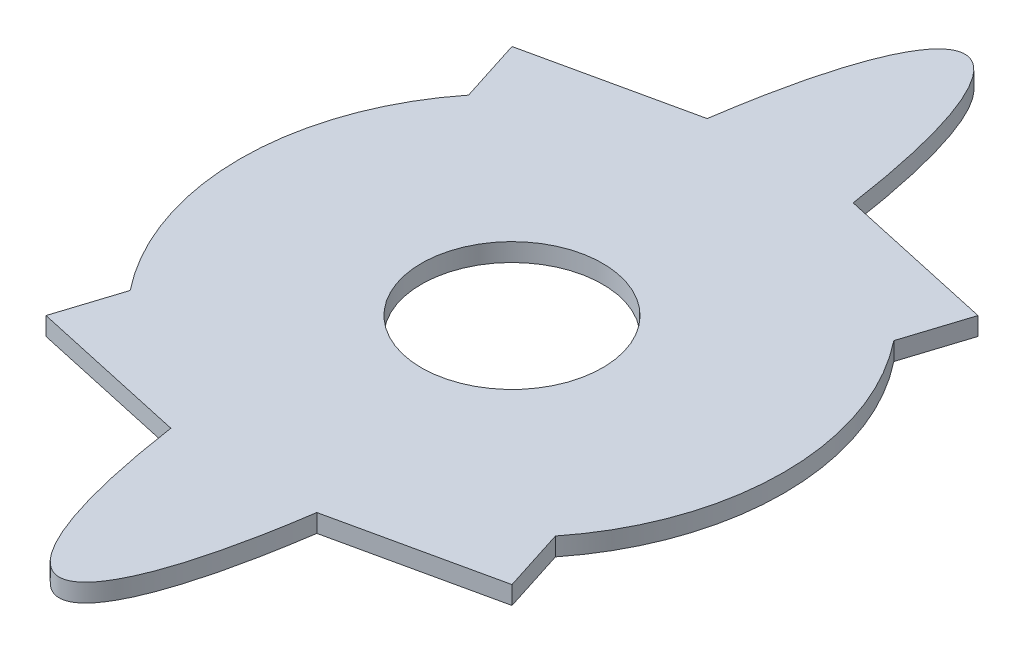
ISO-10303-21;
HEADER;
FILE_DESCRIPTION(('STEP AP214'),'2;1');
FILE_NAME('part.step','',(''),(''),'','','');
FILE_SCHEMA(('AUTOMOTIVE_DESIGN { 1 0 10303 214 1 1 1 1 }'));
ENDSEC;
DATA;
#1=APPLICATION_CONTEXT('core data for automotive mechanical design processes');
#2=APPLICATION_PROTOCOL_DEFINITION('international standard','automotive_design',2000,#1);
#3=PRODUCT_CONTEXT('',#1,'mechanical');
#4=PRODUCT('Part','Part','',(#3));
#5=PRODUCT_RELATED_PRODUCT_CATEGORY('part','',(#4));
#6=PRODUCT_DEFINITION_FORMATION('','',#4);
#7=PRODUCT_DEFINITION_CONTEXT('part definition',#1,'design');
#8=PRODUCT_DEFINITION('design','',#6,#7);
#9=PRODUCT_DEFINITION_SHAPE('','',#8);
#10=(LENGTH_UNIT() NAMED_UNIT(*) SI_UNIT(.MILLI.,.METRE.));
#11=(NAMED_UNIT(*) PLANE_ANGLE_UNIT() SI_UNIT($,.RADIAN.));
#12=(NAMED_UNIT(*) SI_UNIT($,.STERADIAN.) SOLID_ANGLE_UNIT());
#13=UNCERTAINTY_MEASURE_WITH_UNIT(LENGTH_MEASURE(1.E-05),#10,'distance_accuracy_value','');
#14=(GEOMETRIC_REPRESENTATION_CONTEXT(3) GLOBAL_UNCERTAINTY_ASSIGNED_CONTEXT((#13)) GLOBAL_UNIT_ASSIGNED_CONTEXT((#10,
#11,#12)) REPRESENTATION_CONTEXT('',''));
#15=CARTESIAN_POINT('',(0.,0.,0.));
#16=DIRECTION('',(0.,0.,1.));
#17=DIRECTION('',(1.,0.,0.));
#18=AXIS2_PLACEMENT_3D('',#15,#16,#17);
#19=CARTESIAN_POINT('',(-6.57913665277068,2.,29.9329249695814));
#20=DIRECTION('',(0.214671716521423,0.,-0.976686261870078));
#21=DIRECTION('',(-0.976686261870078,0.,-0.214671716521423));
#22=AXIS2_PLACEMENT_3D('',#19,#20,#21);
#23=PLANE('',#22);
#24=DIRECTION('',(0.976686261870078,0.,0.214671716521423));
#25=VECTOR('',#24,1.);
#26=CARTESIAN_POINT('',(-6.57913665277068,0.,29.9329249695814));
#27=LINE('',#26,#25);
#28=CARTESIAN_POINT('',(-25.7247877713763,0.,25.7247877713763));
#29=VERTEX_POINT('',#28);
#30=CARTESIAN_POINT('',(-8.05822964025379,0.,29.6078262731896));
#31=VERTEX_POINT('',#30);
#32=EDGE_CURVE('E158',#29,#31,#27,.T.);
#33=ORIENTED_EDGE('',*,*,#32,.T.);
#34=DIRECTION('',(0.,-1.,0.));
#35=VECTOR('',#34,1.);
#36=CARTESIAN_POINT('',(-8.05822964025379,2.,29.6078262731896));
#37=LINE('',#36,#35);
#38=CARTESIAN_POINT('',(-8.05822964025379,2.,29.6078262731896));
#39=VERTEX_POINT('',#38);
#40=EDGE_CURVE('E11',#39,#31,#37,.T.);
#41=ORIENTED_EDGE('',*,*,#40,.F.);
#42=DIRECTION('',(0.976686261870078,0.,0.214671716521423));
#43=VECTOR('',#42,1.);
#44=CARTESIAN_POINT('',(-6.57913665277068,2.,29.9329249695814));
#45=LINE('',#44,#43);
#46=CARTESIAN_POINT('',(-25.7247877713763,2.,25.7247877713763));
#47=VERTEX_POINT('',#46);
#48=EDGE_CURVE('E191',#47,#39,#45,.T.);
#49=ORIENTED_EDGE('',*,*,#48,.F.);
#50=DIRECTION('',(0.,-1.,0.));
#51=VECTOR('',#50,1.);
#52=CARTESIAN_POINT('',(-25.7247877713763,2.,25.7247877713763));
#53=LINE('',#52,#51);
#54=EDGE_CURVE('E50',#47,#29,#53,.T.);
#55=ORIENTED_EDGE('',*,*,#54,.T.);
#56=EDGE_LOOP('',(#33,#41,#49,#55));
#57=FACE_BOUND('',#56,.T.);
#58=ADVANCED_FACE('F34',(#57),#23,.F.);
#59=CARTESIAN_POINT('',(0.,2.,0.));
#60=DIRECTION('',(0.,1.,0.));
#61=DIRECTION('',(0.,0.,-1.));
#62=AXIS2_PLACEMENT_3D('',#59,#60,#61);
#63=ELLIPSE('',#62,50.,10.);
#64=DIRECTION('',(0.,-1.,0.));
#65=VECTOR('',#64,1.);
#66=SURFACE_OF_LINEAR_EXTRUSION('',#63,#65);
#67=CARTESIAN_POINT('',(0.,0.,0.));
#68=DIRECTION('',(0.,1.,0.));
#69=DIRECTION('',(0.,0.,-1.));
#70=AXIS2_PLACEMENT_3D('',#67,#68,#69);
#71=ELLIPSE('',#70,50.,10.);
#72=CARTESIAN_POINT('',(8.05822964025379,0.,29.6078262731896));
#73=VERTEX_POINT('',#72);
#74=EDGE_CURVE('E160',#31,#73,#71,.T.);
#75=ORIENTED_EDGE('',*,*,#74,.T.);
#76=DIRECTION('',(0.,-1.,0.));
#77=VECTOR('',#76,1.);
#78=CARTESIAN_POINT('',(8.05822964025379,2.,29.6078262731896));
#79=LINE('',#78,#77);
#80=CARTESIAN_POINT('',(8.05822964025379,2.,29.6078262731896));
#81=VERTEX_POINT('',#80);
#82=EDGE_CURVE('E42',#81,#73,#79,.T.);
#83=ORIENTED_EDGE('',*,*,#82,.F.);
#84=EDGE_CURVE('E101',#39,#81,#63,.T.);
#85=ORIENTED_EDGE('',*,*,#84,.F.);
#86=ORIENTED_EDGE('',*,*,#40,.T.);
#87=EDGE_LOOP('',(#75,#83,#85,#86));
#88=FACE_BOUND('',#87,.T.);
#89=ADVANCED_FACE('F214',(#88),#66,.F.);
#90=CARTESIAN_POINT('',(6.57913665277068,2.,29.9329249695814));
#91=DIRECTION('',(0.214671716521423,0.,0.976686261870078));
#92=DIRECTION('',(0.976686261870078,0.,-0.214671716521423));
#93=AXIS2_PLACEMENT_3D('',#90,#91,#92);
#94=PLANE('',#93);
#95=DIRECTION('',(-0.976686261870078,0.,0.214671716521423));
#96=VECTOR('',#95,1.);
#97=CARTESIAN_POINT('',(6.57913665277068,0.,29.9329249695814));
#98=LINE('',#97,#96);
#99=CARTESIAN_POINT('',(25.7247877713763,0.,25.7247877713763));
#100=VERTEX_POINT('',#99);
#101=EDGE_CURVE('E163',#100,#73,#98,.T.);
#102=ORIENTED_EDGE('',*,*,#101,.F.);
#103=DIRECTION('',(0.,-1.,0.));
#104=VECTOR('',#103,1.);
#105=CARTESIAN_POINT('',(25.7247877713763,2.,25.7247877713763));
#106=LINE('',#105,#104);
#107=CARTESIAN_POINT('',(25.7247877713763,2.,25.7247877713763));
#108=VERTEX_POINT('',#107);
#109=EDGE_CURVE('E207',#108,#100,#106,.T.);
#110=ORIENTED_EDGE('',*,*,#109,.F.);
#111=DIRECTION('',(-0.976686261870078,0.,0.214671716521423));
#112=VECTOR('',#111,1.);
#113=CARTESIAN_POINT('',(6.57913665277068,2.,29.9329249695814));
#114=LINE('',#113,#112);
#115=EDGE_CURVE('E213',#108,#81,#114,.T.);
#116=ORIENTED_EDGE('',*,*,#115,.T.);
#117=ORIENTED_EDGE('',*,*,#82,.T.);
#118=EDGE_LOOP('',(#102,#110,#116,#117));
#119=FACE_BOUND('',#118,.T.);
#120=ADVANCED_FACE('F211',(#119),#94,.T.);
#121=CARTESIAN_POINT('',(15.8914343916397,2.,-5.07380600599683));
#122=DIRECTION('',(-0.952623234761932,0.,0.304152877007126));
#123=DIRECTION('',(0.304152877007126,0.,0.952623234761932));
#124=AXIS2_PLACEMENT_3D('',#121,#122,#123);
#125=PLANE('',#124);
#126=DIRECTION('',(-0.304152877007126,0.,-0.952623234761932));
#127=VECTOR('',#126,1.);
#128=CARTESIAN_POINT('',(15.8914343916397,0.,-5.07380600599683));
#129=LINE('',#128,#127);
#130=CARTESIAN_POINT('',(23.4752703567732,0.,18.679177756968));
#131=VERTEX_POINT('',#130);
#132=EDGE_CURVE('E166',#100,#131,#129,.T.);
#133=ORIENTED_EDGE('',*,*,#132,.T.);
#134=DIRECTION('',(0.,-1.,0.));
#135=VECTOR('',#134,1.);
#136=CARTESIAN_POINT('',(23.4752703567732,2.,18.679177756968));
#137=LINE('',#136,#135);
#138=CARTESIAN_POINT('',(23.4752703567732,2.,18.679177756968));
#139=VERTEX_POINT('',#138);
#140=EDGE_CURVE('E204',#139,#131,#137,.T.);
#141=ORIENTED_EDGE('',*,*,#140,.F.);
#142=DIRECTION('',(-0.304152877007126,0.,-0.952623234761932));
#143=VECTOR('',#142,1.);
#144=CARTESIAN_POINT('',(15.8914343916397,2.,-5.07380600599683));
#145=LINE('',#144,#143);
#146=EDGE_CURVE('E233',#108,#139,#145,.T.);
#147=ORIENTED_EDGE('',*,*,#146,.F.);
#148=ORIENTED_EDGE('',*,*,#109,.T.);
#149=EDGE_LOOP('',(#133,#141,#147,#148));
#150=FACE_BOUND('',#149,.T.);
#151=ADVANCED_FACE('F223',(#150),#125,.F.);
#152=CARTESIAN_POINT('',(0.,2.,0.));
#153=DIRECTION('',(0.,-1.,0.));
#154=DIRECTION('',(0.,0.,-1.));
#155=AXIS2_PLACEMENT_3D('',#152,#153,#154);
#156=CYLINDRICAL_SURFACE('',#155,30.);
#157=CARTESIAN_POINT('',(0.,0.,0.));
#158=DIRECTION('',(0.,1.,0.));
#159=DIRECTION('',(0.,0.,1.));
#160=AXIS2_PLACEMENT_3D('',#157,#158,#159);
#161=CIRCLE('',#160,30.);
#162=CARTESIAN_POINT('',(23.4752703567732,0.,-18.679177756968));
#163=VERTEX_POINT('',#162);
#164=EDGE_CURVE('E168',#131,#163,#161,.T.);
#165=ORIENTED_EDGE('',*,*,#164,.T.);
#166=DIRECTION('',(0.,-1.,0.));
#167=VECTOR('',#166,1.);
#168=CARTESIAN_POINT('',(23.4752703567732,2.,-18.679177756968));
#169=LINE('',#168,#167);
#170=CARTESIAN_POINT('',(23.4752703567732,2.,-18.679177756968));
#171=VERTEX_POINT('',#170);
#172=EDGE_CURVE('E202',#171,#163,#169,.T.);
#173=ORIENTED_EDGE('',*,*,#172,.F.);
#174=CARTESIAN_POINT('',(0.,2.,0.));
#175=DIRECTION('',(0.,1.,0.));
#176=DIRECTION('',(0.,0.,1.));
#177=AXIS2_PLACEMENT_3D('',#174,#175,#176);
#178=CIRCLE('',#177,30.);
#179=EDGE_CURVE('E229',#139,#171,#178,.T.);
#180=ORIENTED_EDGE('',*,*,#179,.F.);
#181=ORIENTED_EDGE('',*,*,#140,.T.);
#182=EDGE_LOOP('',(#165,#173,#180,#181));
#183=FACE_BOUND('',#182,.T.);
#184=ADVANCED_FACE('F227',(#183),#156,.T.);
#185=CARTESIAN_POINT('',(15.8914343916397,2.,5.07380600599683));
#186=DIRECTION('',(0.952623234761932,0.,0.304152877007126));
#187=DIRECTION('',(0.304152877007126,0.,-0.952623234761932));
#188=AXIS2_PLACEMENT_3D('',#185,#186,#187);
#189=PLANE('',#188);
#190=DIRECTION('',(-0.304152877007126,0.,0.952623234761932));
#191=VECTOR('',#190,1.);
#192=CARTESIAN_POINT('',(15.8914343916397,0.,5.07380600599683));
#193=LINE('',#192,#191);
#194=CARTESIAN_POINT('',(25.7247877713763,0.,-25.7247877713763));
#195=VERTEX_POINT('',#194);
#196=EDGE_CURVE('E171',#195,#163,#193,.T.);
#197=ORIENTED_EDGE('',*,*,#196,.F.);
#198=DIRECTION('',(0.,-1.,0.));
#199=VECTOR('',#198,1.);
#200=CARTESIAN_POINT('',(25.7247877713763,2.,-25.7247877713763));
#201=LINE('',#200,#199);
#202=CARTESIAN_POINT('',(25.7247877713763,2.,-25.7247877713763));
#203=VERTEX_POINT('',#202);
#204=EDGE_CURVE('E200',#203,#195,#201,.T.);
#205=ORIENTED_EDGE('',*,*,#204,.F.);
#206=DIRECTION('',(-0.304152877007126,0.,0.952623234761932));
#207=VECTOR('',#206,1.);
#208=CARTESIAN_POINT('',(15.8914343916397,2.,5.07380600599683));
#209=LINE('',#208,#207);
#210=EDGE_CURVE('E232',#203,#171,#209,.T.);
#211=ORIENTED_EDGE('',*,*,#210,.T.);
#212=ORIENTED_EDGE('',*,*,#172,.T.);
#213=EDGE_LOOP('',(#197,#205,#211,#212));
#214=FACE_BOUND('',#213,.T.);
#215=ADVANCED_FACE('F254',(#214),#189,.T.);
#216=CARTESIAN_POINT('',(6.57913665277068,2.,-29.9329249695814));
#217=DIRECTION('',(-0.214671716521423,0.,0.976686261870078));
#218=DIRECTION('',(0.976686261870078,0.,0.214671716521423));
#219=AXIS2_PLACEMENT_3D('',#216,#217,#218);
#220=PLANE('',#219);
#221=DIRECTION('',(-0.976686261870078,0.,-0.214671716521423));
#222=VECTOR('',#221,1.);
#223=CARTESIAN_POINT('',(6.57913665277068,0.,-29.9329249695814));
#224=LINE('',#223,#222);
#225=CARTESIAN_POINT('',(8.05822964025379,0.,-29.6078262731896));
#226=VERTEX_POINT('',#225);
#227=EDGE_CURVE('E174',#195,#226,#224,.T.);
#228=ORIENTED_EDGE('',*,*,#227,.T.);
#229=DIRECTION('',(0.,-1.,0.));
#230=VECTOR('',#229,1.);
#231=CARTESIAN_POINT('',(8.05822964025379,2.,-29.6078262731896));
#232=LINE('',#231,#230);
#233=CARTESIAN_POINT('',(8.05822964025379,2.,-29.6078262731896));
#234=VERTEX_POINT('',#233);
#235=EDGE_CURVE('E197',#234,#226,#232,.T.);
#236=ORIENTED_EDGE('',*,*,#235,.F.);
#237=DIRECTION('',(-0.976686261870078,0.,-0.214671716521423));
#238=VECTOR('',#237,1.);
#239=CARTESIAN_POINT('',(6.57913665277068,2.,-29.9329249695814));
#240=LINE('',#239,#238);
#241=EDGE_CURVE('E235',#203,#234,#240,.T.);
#242=ORIENTED_EDGE('',*,*,#241,.F.);
#243=ORIENTED_EDGE('',*,*,#204,.T.);
#244=EDGE_LOOP('',(#228,#236,#242,#243));
#245=FACE_BOUND('',#244,.T.);
#246=ADVANCED_FACE('F249',(#245),#220,.F.);
#247=CARTESIAN_POINT('',(0.,2.,0.));
#248=DIRECTION('',(0.,1.,0.));
#249=DIRECTION('',(0.,0.,-1.));
#250=AXIS2_PLACEMENT_3D('',#247,#248,#249);
#251=ELLIPSE('',#250,50.,10.);
#252=DIRECTION('',(0.,-1.,0.));
#253=VECTOR('',#252,1.);
#254=SURFACE_OF_LINEAR_EXTRUSION('',#251,#253);
#255=CARTESIAN_POINT('',(0.,0.,0.));
#256=DIRECTION('',(0.,1.,0.));
#257=DIRECTION('',(0.,0.,-1.));
#258=AXIS2_PLACEMENT_3D('',#255,#256,#257);
#259=ELLIPSE('',#258,50.,10.);
#260=CARTESIAN_POINT('',(-8.05822964025379,0.,-29.6078262731896));
#261=VERTEX_POINT('',#260);
#262=EDGE_CURVE('E176',#226,#261,#259,.T.);
#263=ORIENTED_EDGE('',*,*,#262,.T.);
#264=DIRECTION('',(0.,-1.,0.));
#265=VECTOR('',#264,1.);
#266=CARTESIAN_POINT('',(-8.05822964025379,2.,-29.6078262731896));
#267=LINE('',#266,#265);
#268=CARTESIAN_POINT('',(-8.05822964025379,2.,-29.6078262731896));
#269=VERTEX_POINT('',#268);
#270=EDGE_CURVE('E195',#269,#261,#267,.T.);
#271=ORIENTED_EDGE('',*,*,#270,.F.);
#272=EDGE_CURVE('E241',#234,#269,#251,.T.);
#273=ORIENTED_EDGE('',*,*,#272,.F.);
#274=ORIENTED_EDGE('',*,*,#235,.T.);
#275=EDGE_LOOP('',(#263,#271,#273,#274));
#276=FACE_BOUND('',#275,.T.);
#277=ADVANCED_FACE('F244',(#276),#254,.F.);
#278=CARTESIAN_POINT('',(-6.57913665277068,2.,-29.9329249695814));
#279=DIRECTION('',(-0.214671716521423,0.,-0.976686261870078));
#280=DIRECTION('',(-0.976686261870078,0.,0.214671716521423));
#281=AXIS2_PLACEMENT_3D('',#278,#279,#280);
#282=PLANE('',#281);
#283=DIRECTION('',(0.976686261870078,0.,-0.214671716521423));
#284=VECTOR('',#283,1.);
#285=CARTESIAN_POINT('',(-6.57913665277068,0.,-29.9329249695814));
#286=LINE('',#285,#284);
#287=CARTESIAN_POINT('',(-25.7247877713763,0.,-25.7247877713763));
#288=VERTEX_POINT('',#287);
#289=EDGE_CURVE('E179',#288,#261,#286,.T.);
#290=ORIENTED_EDGE('',*,*,#289,.F.);
#291=DIRECTION('',(0.,-1.,0.));
#292=VECTOR('',#291,1.);
#293=CARTESIAN_POINT('',(-25.7247877713763,2.,-25.7247877713763));
#294=LINE('',#293,#292);
#295=CARTESIAN_POINT('',(-25.7247877713763,2.,-25.7247877713763));
#296=VERTEX_POINT('',#295);
#297=EDGE_CURVE('E147',#296,#288,#294,.T.);
#298=ORIENTED_EDGE('',*,*,#297,.F.);
#299=DIRECTION('',(0.976686261870078,0.,-0.214671716521423));
#300=VECTOR('',#299,1.);
#301=CARTESIAN_POINT('',(-6.57913665277068,2.,-29.9329249695814));
#302=LINE('',#301,#300);
#303=EDGE_CURVE('E137',#296,#269,#302,.T.);
#304=ORIENTED_EDGE('',*,*,#303,.T.);
#305=ORIENTED_EDGE('',*,*,#270,.T.);
#306=EDGE_LOOP('',(#290,#298,#304,#305));
#307=FACE_BOUND('',#306,.T.);
#308=ADVANCED_FACE('F248',(#307),#282,.T.);
#309=CARTESIAN_POINT('',(-15.8914343916397,2.,5.07380600599683));
#310=DIRECTION('',(0.952623234761932,0.,-0.304152877007126));
#311=DIRECTION('',(-0.304152877007126,0.,-0.952623234761932));
#312=AXIS2_PLACEMENT_3D('',#309,#310,#311);
#313=PLANE('',#312);
#314=DIRECTION('',(0.304152877007126,0.,0.952623234761932));
#315=VECTOR('',#314,1.);
#316=CARTESIAN_POINT('',(-15.8914343916397,0.,5.07380600599683));
#317=LINE('',#316,#315);
#318=CARTESIAN_POINT('',(-23.4752703567732,0.,-18.679177756968));
#319=VERTEX_POINT('',#318);
#320=EDGE_CURVE('E144',#288,#319,#317,.T.);
#321=ORIENTED_EDGE('',*,*,#320,.T.);
#322=DIRECTION('',(0.,-1.,0.));
#323=VECTOR('',#322,1.);
#324=CARTESIAN_POINT('',(-23.4752703567732,2.,-18.679177756968));
#325=LINE('',#324,#323);
#326=CARTESIAN_POINT('',(-23.4752703567732,2.,-18.679177756968));
#327=VERTEX_POINT('',#326);
#328=EDGE_CURVE('E141',#327,#319,#325,.T.);
#329=ORIENTED_EDGE('',*,*,#328,.F.);
#330=DIRECTION('',(0.304152877007126,0.,0.952623234761932));
#331=VECTOR('',#330,1.);
#332=CARTESIAN_POINT('',(-15.8914343916397,2.,5.07380600599683));
#333=LINE('',#332,#331);
#334=EDGE_CURVE('E129',#296,#327,#333,.T.);
#335=ORIENTED_EDGE('',*,*,#334,.F.);
#336=ORIENTED_EDGE('',*,*,#297,.T.);
#337=EDGE_LOOP('',(#321,#329,#335,#336));
#338=FACE_BOUND('',#337,.T.);
#339=ADVANCED_FACE('F142',(#338),#313,.F.);
#340=CARTESIAN_POINT('',(0.,2.,0.));
#341=DIRECTION('',(0.,-1.,0.));
#342=DIRECTION('',(0.,0.,-1.));
#343=AXIS2_PLACEMENT_3D('',#340,#341,#342);
#344=CYLINDRICAL_SURFACE('',#343,30.);
#345=CARTESIAN_POINT('',(0.,0.,0.));
#346=DIRECTION('',(0.,1.,0.));
#347=DIRECTION('',(0.,0.,1.));
#348=AXIS2_PLACEMENT_3D('',#345,#346,#347);
#349=CIRCLE('',#348,30.);
#350=CARTESIAN_POINT('',(-23.4752703567732,0.,18.679177756968));
#351=VERTEX_POINT('',#350);
#352=EDGE_CURVE('E183',#319,#351,#349,.T.);
#353=ORIENTED_EDGE('',*,*,#352,.T.);
#354=DIRECTION('',(0.,-1.,0.));
#355=VECTOR('',#354,1.);
#356=CARTESIAN_POINT('',(-23.4752703567732,2.,18.679177756968));
#357=LINE('',#356,#355);
#358=CARTESIAN_POINT('',(-23.4752703567732,2.,18.679177756968));
#359=VERTEX_POINT('',#358);
#360=EDGE_CURVE('E89',#359,#351,#357,.T.);
#361=ORIENTED_EDGE('',*,*,#360,.F.);
#362=CARTESIAN_POINT('',(0.,2.,0.));
#363=DIRECTION('',(0.,1.,0.));
#364=DIRECTION('',(0.,0.,1.));
#365=AXIS2_PLACEMENT_3D('',#362,#363,#364);
#366=CIRCLE('',#365,30.);
#367=EDGE_CURVE('E135',#327,#359,#366,.T.);
#368=ORIENTED_EDGE('',*,*,#367,.F.);
#369=ORIENTED_EDGE('',*,*,#328,.T.);
#370=EDGE_LOOP('',(#353,#361,#368,#369));
#371=FACE_BOUND('',#370,.T.);
#372=ADVANCED_FACE('F149',(#371),#344,.T.);
#373=CARTESIAN_POINT('',(-15.8914343916397,2.,-5.07380600599683));
#374=DIRECTION('',(-0.952623234761932,0.,-0.304152877007126));
#375=DIRECTION('',(-0.304152877007126,0.,0.952623234761932));
#376=AXIS2_PLACEMENT_3D('',#373,#374,#375);
#377=PLANE('',#376);
#378=DIRECTION('',(0.304152877007126,0.,-0.952623234761932));
#379=VECTOR('',#378,1.);
#380=CARTESIAN_POINT('',(-15.8914343916397,0.,-5.07380600599683));
#381=LINE('',#380,#379);
#382=EDGE_CURVE('E185',#29,#351,#381,.T.);
#383=ORIENTED_EDGE('',*,*,#382,.F.);
#384=ORIENTED_EDGE('',*,*,#54,.F.);
#385=DIRECTION('',(0.304152877007126,0.,-0.952623234761932));
#386=VECTOR('',#385,1.);
#387=CARTESIAN_POINT('',(-15.8914343916397,2.,-5.07380600599683));
#388=LINE('',#387,#386);
#389=EDGE_CURVE('E150',#47,#359,#388,.T.);
#390=ORIENTED_EDGE('',*,*,#389,.T.);
#391=ORIENTED_EDGE('',*,*,#360,.T.);
#392=EDGE_LOOP('',(#383,#384,#390,#391));
#393=FACE_BOUND('',#392,.T.);
#394=ADVANCED_FACE('F268',(#393),#377,.T.);
#395=CARTESIAN_POINT('',(0.,2.,0.));
#396=DIRECTION('',(0.,-1.,0.));
#397=DIRECTION('',(0.,0.,-1.));
#398=AXIS2_PLACEMENT_3D('',#395,#396,#397);
#399=CYLINDRICAL_SURFACE('',#398,10.);
#400=CARTESIAN_POINT('',(0.,2.,0.));
#401=DIRECTION('',(0.,1.,0.));
#402=DIRECTION('',(0.,0.,1.));
#403=AXIS2_PLACEMENT_3D('',#400,#401,#402);
#404=CIRCLE('',#403,10.);
#405=CARTESIAN_POINT('',(0.,2.,10.));
#406=VERTEX_POINT('',#405);
#407=EDGE_CURVE('E152',#406,#406,#404,.T.);
#408=ORIENTED_EDGE('',*,*,#407,.T.);
#409=EDGE_LOOP('',(#408));
#410=FACE_BOUND('',#409,.T.);
#411=CARTESIAN_POINT('',(0.,0.,0.));
#412=DIRECTION('',(0.,1.,0.));
#413=DIRECTION('',(0.,0.,1.));
#414=AXIS2_PLACEMENT_3D('',#411,#412,#413);
#415=CIRCLE('',#414,10.);
#416=CARTESIAN_POINT('',(0.,0.,10.));
#417=VERTEX_POINT('',#416);
#418=EDGE_CURVE('E188',#417,#417,#415,.T.);
#419=ORIENTED_EDGE('',*,*,#418,.F.);
#420=EDGE_LOOP('',(#419));
#421=FACE_BOUND('',#420,.T.);
#422=ADVANCED_FACE('F270',(#410,#421),#399,.F.);
#423=CARTESIAN_POINT('',(0.,2.,0.));
#424=DIRECTION('',(0.,1.,0.));
#425=DIRECTION('',(0.,0.,1.));
#426=AXIS2_PLACEMENT_3D('',#423,#424,#425);
#427=PLANE('',#426);
#428=ORIENTED_EDGE('',*,*,#48,.T.);
#429=ORIENTED_EDGE('',*,*,#84,.T.);
#430=ORIENTED_EDGE('',*,*,#115,.F.);
#431=ORIENTED_EDGE('',*,*,#146,.T.);
#432=ORIENTED_EDGE('',*,*,#179,.T.);
#433=ORIENTED_EDGE('',*,*,#210,.F.);
#434=ORIENTED_EDGE('',*,*,#241,.T.);
#435=ORIENTED_EDGE('',*,*,#272,.T.);
#436=ORIENTED_EDGE('',*,*,#303,.F.);
#437=ORIENTED_EDGE('',*,*,#334,.T.);
#438=ORIENTED_EDGE('',*,*,#367,.T.);
#439=ORIENTED_EDGE('',*,*,#389,.F.);
#440=EDGE_LOOP('',(#428,#429,#430,#431,#432,#433,#434,#435,#436,#437,#438,#439));
#441=FACE_BOUND('',#440,.T.);
#442=ORIENTED_EDGE('',*,*,#407,.F.);
#443=EDGE_LOOP('',(#442));
#444=FACE_BOUND('',#443,.T.);
#445=ADVANCED_FACE('F131',(#441,#444),#427,.T.);
#446=CARTESIAN_POINT('',(0.,0.,0.));
#447=DIRECTION('',(0.,1.,0.));
#448=DIRECTION('',(0.,0.,1.));
#449=AXIS2_PLACEMENT_3D('',#446,#447,#448);
#450=PLANE('',#449);
#451=ORIENTED_EDGE('',*,*,#32,.F.);
#452=ORIENTED_EDGE('',*,*,#382,.T.);
#453=ORIENTED_EDGE('',*,*,#352,.F.);
#454=ORIENTED_EDGE('',*,*,#320,.F.);
#455=ORIENTED_EDGE('',*,*,#289,.T.);
#456=ORIENTED_EDGE('',*,*,#262,.F.);
#457=ORIENTED_EDGE('',*,*,#227,.F.);
#458=ORIENTED_EDGE('',*,*,#196,.T.);
#459=ORIENTED_EDGE('',*,*,#164,.F.);
#460=ORIENTED_EDGE('',*,*,#132,.F.);
#461=ORIENTED_EDGE('',*,*,#101,.T.);
#462=ORIENTED_EDGE('',*,*,#74,.F.);
#463=EDGE_LOOP('',(#451,#452,#453,#454,#455,#456,#457,#458,#459,#460,#461,#462));
#464=FACE_BOUND('',#463,.T.);
#465=ORIENTED_EDGE('',*,*,#418,.T.);
#466=EDGE_LOOP('',(#465));
#467=FACE_BOUND('',#466,.T.);
#468=ADVANCED_FACE('F218',(#464,#467),#450,.F.);
#469=CLOSED_SHELL('',(#58,#89,#120,#151,#184,#215,#246,#277,#308,#339,#372,#394,#422,#445,#468));
#470=MANIFOLD_SOLID_BREP('B2',#469);
#471=ADVANCED_BREP_SHAPE_REPRESENTATION('',(#18,#470),#14);
#472=SHAPE_DEFINITION_REPRESENTATION(#9,#471);
ENDSEC;
END-ISO-10303-21;
